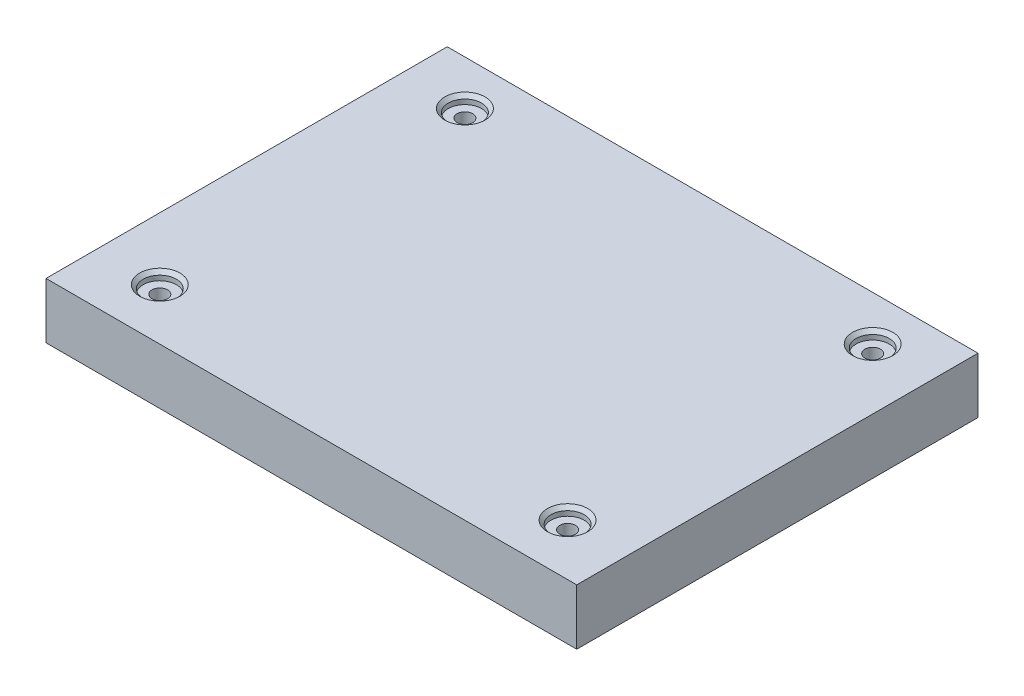
ISO-10303-21;
HEADER;
FILE_DESCRIPTION(('STEP AP214'),'2;1');
FILE_NAME('part.step','',(''),(''),'','','');
FILE_SCHEMA(('AUTOMOTIVE_DESIGN { 1 0 10303 214 1 1 1 1 }'));
ENDSEC;
DATA;
#1=APPLICATION_CONTEXT('core data for automotive mechanical design processes');
#2=APPLICATION_PROTOCOL_DEFINITION('international standard','automotive_design',2000,#1);
#3=PRODUCT_CONTEXT('',#1,'mechanical');
#4=PRODUCT('Part','Part','',(#3));
#5=PRODUCT_RELATED_PRODUCT_CATEGORY('part','',(#4));
#6=PRODUCT_DEFINITION_FORMATION('','',#4);
#7=PRODUCT_DEFINITION_CONTEXT('part definition',#1,'design');
#8=PRODUCT_DEFINITION('design','',#6,#7);
#9=PRODUCT_DEFINITION_SHAPE('','',#8);
#10=(LENGTH_UNIT() NAMED_UNIT(*) SI_UNIT(.MILLI.,.METRE.));
#11=(NAMED_UNIT(*) PLANE_ANGLE_UNIT() SI_UNIT($,.RADIAN.));
#12=(NAMED_UNIT(*) SI_UNIT($,.STERADIAN.) SOLID_ANGLE_UNIT());
#13=UNCERTAINTY_MEASURE_WITH_UNIT(LENGTH_MEASURE(1.E-05),#10,'distance_accuracy_value','');
#14=(GEOMETRIC_REPRESENTATION_CONTEXT(3) GLOBAL_UNCERTAINTY_ASSIGNED_CONTEXT((#13)) GLOBAL_UNIT_ASSIGNED_CONTEXT((#10,
#11,#12)) REPRESENTATION_CONTEXT('',''));
#15=CARTESIAN_POINT('',(0.,0.,0.));
#16=DIRECTION('',(0.,0.,1.));
#17=DIRECTION('',(1.,0.,0.));
#18=AXIS2_PLACEMENT_3D('',#15,#16,#17);
#19=CARTESIAN_POINT('',(0.,10.,0.));
#20=DIRECTION('',(0.,-1.,0.));
#21=DIRECTION('',(0.,0.,-1.));
#22=AXIS2_PLACEMENT_3D('',#19,#20,#21);
#23=PLANE('',#22);
#24=CARTESIAN_POINT('',(11.17,10.,-9.23722147848022));
#25=DIRECTION('',(0.,1.,0.));
#26=DIRECTION('',(0.,0.,1.));
#27=AXIS2_PLACEMENT_3D('',#24,#25,#26);
#28=CIRCLE('',#27,3.61188);
#29=CARTESIAN_POINT('',(11.17,10.,-5.62534147848022));
#30=VERTEX_POINT('',#29);
#31=EDGE_CURVE('E168',#30,#30,#28,.T.);
#32=ORIENTED_EDGE('',*,*,#31,.F.);
#33=EDGE_LOOP('',(#32));
#34=FACE_BOUND('',#33,.T.);
#35=CARTESIAN_POINT('',(11.17,10.,-63.9442401855916));
#36=DIRECTION('',(0.,1.,0.));
#37=DIRECTION('',(0.,0.,1.));
#38=AXIS2_PLACEMENT_3D('',#35,#36,#37);
#39=CIRCLE('',#38,3.61188);
#40=CARTESIAN_POINT('',(11.17,10.,-60.3323601855916));
#41=VERTEX_POINT('',#40);
#42=EDGE_CURVE('E138',#41,#41,#39,.T.);
#43=ORIENTED_EDGE('',*,*,#42,.F.);
#44=EDGE_LOOP('',(#43));
#45=FACE_BOUND('',#44,.T.);
#46=CARTESIAN_POINT('',(84.2999996075257,10.,-9.22964498225284));
#47=DIRECTION('',(0.,1.,0.));
#48=DIRECTION('',(0.,0.,1.));
#49=AXIS2_PLACEMENT_3D('',#46,#47,#48);
#50=CIRCLE('',#49,3.61188);
#51=CARTESIAN_POINT('',(84.2999996075257,10.,-5.61776498225284));
#52=VERTEX_POINT('',#51);
#53=EDGE_CURVE('E123',#52,#52,#50,.T.);
#54=ORIENTED_EDGE('',*,*,#53,.F.);
#55=EDGE_LOOP('',(#54));
#56=FACE_BOUND('',#55,.T.);
#57=DIRECTION('',(0.,0.,1.));
#58=VECTOR('',#57,1.);
#59=CARTESIAN_POINT('',(0.,10.,0.));
#60=LINE('',#59,#58);
#61=CARTESIAN_POINT('',(0.,10.,-71.94964485833));
#62=VERTEX_POINT('',#61);
#63=CARTESIAN_POINT('',(0.,10.,0.));
#64=VERTEX_POINT('',#63);
#65=EDGE_CURVE('E85',#62,#64,#60,.T.);
#66=ORIENTED_EDGE('',*,*,#65,.T.);
#67=DIRECTION('',(1.,0.,0.));
#68=VECTOR('',#67,1.);
#69=CARTESIAN_POINT('',(0.,10.,0.));
#70=LINE('',#69,#68);
#71=CARTESIAN_POINT('',(95.169284226503,10.,0.));
#72=VERTEX_POINT('',#71);
#73=EDGE_CURVE('E80',#64,#72,#70,.T.);
#74=ORIENTED_EDGE('',*,*,#73,.T.);
#75=DIRECTION('',(0.,0.,-1.));
#76=VECTOR('',#75,1.);
#77=CARTESIAN_POINT('',(95.169284226503,10.,0.));
#78=LINE('',#77,#76);
#79=CARTESIAN_POINT('',(95.169284226503,10.,-71.94964485833));
#80=VERTEX_POINT('',#79);
#81=EDGE_CURVE('E83',#72,#80,#78,.T.);
#82=ORIENTED_EDGE('',*,*,#81,.T.);
#83=DIRECTION('',(-1.,0.,0.));
#84=VECTOR('',#83,1.);
#85=CARTESIAN_POINT('',(0.,10.,-71.94964485833));
#86=LINE('',#85,#84);
#87=EDGE_CURVE('E50',#80,#62,#86,.T.);
#88=ORIENTED_EDGE('',*,*,#87,.T.);
#89=EDGE_LOOP('',(#66,#74,#82,#88));
#90=FACE_BOUND('',#89,.T.);
#91=CARTESIAN_POINT('',(84.2963172661727,10.,-63.93964485833));
#92=DIRECTION('',(0.,1.,0.));
#93=DIRECTION('',(0.,0.,1.));
#94=AXIS2_PLACEMENT_3D('',#91,#92,#93);
#95=CIRCLE('',#94,3.61188);
#96=CARTESIAN_POINT('',(84.2963172661727,10.,-60.32776485833));
#97=VERTEX_POINT('',#96);
#98=EDGE_CURVE('E153',#97,#97,#95,.T.);
#99=ORIENTED_EDGE('',*,*,#98,.F.);
#100=EDGE_LOOP('',(#99));
#101=FACE_BOUND('',#100,.T.);
#102=ADVANCED_FACE('F33',(#34,#45,#56,#90,#101),#23,.F.);
#103=CARTESIAN_POINT('',(0.,0.,0.));
#104=DIRECTION('',(0.,-1.,0.));
#105=DIRECTION('',(0.,0.,-1.));
#106=AXIS2_PLACEMENT_3D('',#103,#104,#105);
#107=PLANE('',#106);
#108=CARTESIAN_POINT('',(11.17,0.,-9.23722147848022));
#109=DIRECTION('',(0.,1.,0.));
#110=DIRECTION('',(0.,0.,1.));
#111=AXIS2_PLACEMENT_3D('',#108,#109,#110);
#112=CIRCLE('',#111,1.397);
#113=CARTESIAN_POINT('',(11.17,0.,-7.84022147848023));
#114=VERTEX_POINT('',#113);
#115=EDGE_CURVE('E156',#114,#114,#112,.T.);
#116=ORIENTED_EDGE('',*,*,#115,.T.);
#117=EDGE_LOOP('',(#116));
#118=FACE_BOUND('',#117,.T.);
#119=CARTESIAN_POINT('',(84.2963172661727,0.,-63.93964485833));
#120=DIRECTION('',(0.,1.,0.));
#121=DIRECTION('',(0.,0.,1.));
#122=AXIS2_PLACEMENT_3D('',#119,#120,#121);
#123=CIRCLE('',#122,1.397);
#124=CARTESIAN_POINT('',(84.2963172661727,0.,-62.54264485833));
#125=VERTEX_POINT('',#124);
#126=EDGE_CURVE('E141',#125,#125,#123,.T.);
#127=ORIENTED_EDGE('',*,*,#126,.T.);
#128=EDGE_LOOP('',(#127));
#129=FACE_BOUND('',#128,.T.);
#130=DIRECTION('',(0.,0.,1.));
#131=VECTOR('',#130,1.);
#132=CARTESIAN_POINT('',(0.,0.,0.));
#133=LINE('',#132,#131);
#134=CARTESIAN_POINT('',(0.,0.,-71.94964485833));
#135=VERTEX_POINT('',#134);
#136=CARTESIAN_POINT('',(0.,0.,0.));
#137=VERTEX_POINT('',#136);
#138=EDGE_CURVE('E97',#135,#137,#133,.T.);
#139=ORIENTED_EDGE('',*,*,#138,.F.);
#140=DIRECTION('',(-1.,0.,0.));
#141=VECTOR('',#140,1.);
#142=CARTESIAN_POINT('',(0.,0.,-71.94964485833));
#143=LINE('',#142,#141);
#144=CARTESIAN_POINT('',(95.169284226503,0.,-71.94964485833));
#145=VERTEX_POINT('',#144);
#146=EDGE_CURVE('E73',#145,#135,#143,.T.);
#147=ORIENTED_EDGE('',*,*,#146,.F.);
#148=DIRECTION('',(0.,0.,-1.));
#149=VECTOR('',#148,1.);
#150=CARTESIAN_POINT('',(95.169284226503,0.,0.));
#151=LINE('',#150,#149);
#152=CARTESIAN_POINT('',(95.169284226503,0.,0.));
#153=VERTEX_POINT('',#152);
#154=EDGE_CURVE('E67',#153,#145,#151,.T.);
#155=ORIENTED_EDGE('',*,*,#154,.F.);
#156=DIRECTION('',(1.,0.,0.));
#157=VECTOR('',#156,1.);
#158=CARTESIAN_POINT('',(0.,0.,0.));
#159=LINE('',#158,#157);
#160=EDGE_CURVE('E89',#137,#153,#159,.T.);
#161=ORIENTED_EDGE('',*,*,#160,.F.);
#162=EDGE_LOOP('',(#139,#147,#155,#161));
#163=FACE_BOUND('',#162,.T.);
#164=CARTESIAN_POINT('',(84.2999996075257,0.,-9.22964498225284));
#165=DIRECTION('',(0.,1.,0.));
#166=DIRECTION('',(0.,0.,1.));
#167=AXIS2_PLACEMENT_3D('',#164,#165,#166);
#168=CIRCLE('',#167,1.397);
#169=CARTESIAN_POINT('',(84.2999996075257,0.,-7.83264498225284));
#170=VERTEX_POINT('',#169);
#171=EDGE_CURVE('E100',#170,#170,#168,.T.);
#172=ORIENTED_EDGE('',*,*,#171,.T.);
#173=EDGE_LOOP('',(#172));
#174=FACE_BOUND('',#173,.T.);
#175=CARTESIAN_POINT('',(11.17,0.,-63.9442401855916));
#176=DIRECTION('',(0.,1.,0.));
#177=DIRECTION('',(0.,0.,1.));
#178=AXIS2_PLACEMENT_3D('',#175,#176,#177);
#179=CIRCLE('',#178,1.397);
#180=CARTESIAN_POINT('',(11.17,0.,-62.5472401855916));
#181=VERTEX_POINT('',#180);
#182=EDGE_CURVE('E126',#181,#181,#179,.T.);
#183=ORIENTED_EDGE('',*,*,#182,.T.);
#184=EDGE_LOOP('',(#183));
#185=FACE_BOUND('',#184,.T.);
#186=ADVANCED_FACE('F108',(#118,#129,#163,#174,#185),#107,.T.);
#187=CARTESIAN_POINT('',(0.,10.,0.));
#188=DIRECTION('',(1.,0.,0.));
#189=DIRECTION('',(0.,0.,-1.));
#190=AXIS2_PLACEMENT_3D('',#187,#188,#189);
#191=PLANE('',#190);
#192=ORIENTED_EDGE('',*,*,#138,.T.);
#193=DIRECTION('',(0.,-1.,0.));
#194=VECTOR('',#193,1.);
#195=CARTESIAN_POINT('',(0.,10.,0.));
#196=LINE('',#195,#194);
#197=EDGE_CURVE('E11',#64,#137,#196,.T.);
#198=ORIENTED_EDGE('',*,*,#197,.F.);
#199=ORIENTED_EDGE('',*,*,#65,.F.);
#200=DIRECTION('',(0.,-1.,0.));
#201=VECTOR('',#200,1.);
#202=CARTESIAN_POINT('',(0.,10.,-71.94964485833));
#203=LINE('',#202,#201);
#204=EDGE_CURVE('E93',#62,#135,#203,.T.);
#205=ORIENTED_EDGE('',*,*,#204,.T.);
#206=EDGE_LOOP('',(#192,#198,#199,#205));
#207=FACE_BOUND('',#206,.T.);
#208=ADVANCED_FACE('F35',(#207),#191,.F.);
#209=CARTESIAN_POINT('',(0.,10.,0.));
#210=DIRECTION('',(0.,0.,-1.));
#211=DIRECTION('',(-1.,0.,0.));
#212=AXIS2_PLACEMENT_3D('',#209,#210,#211);
#213=PLANE('',#212);
#214=ORIENTED_EDGE('',*,*,#160,.T.);
#215=DIRECTION('',(0.,-1.,0.));
#216=VECTOR('',#215,1.);
#217=CARTESIAN_POINT('',(95.169284226503,10.,0.));
#218=LINE('',#217,#216);
#219=EDGE_CURVE('E42',#72,#153,#218,.T.);
#220=ORIENTED_EDGE('',*,*,#219,.F.);
#221=ORIENTED_EDGE('',*,*,#73,.F.);
#222=ORIENTED_EDGE('',*,*,#197,.T.);
#223=EDGE_LOOP('',(#214,#220,#221,#222));
#224=FACE_BOUND('',#223,.T.);
#225=ADVANCED_FACE('F88',(#224),#213,.F.);
#226=CARTESIAN_POINT('',(95.169284226503,10.,0.));
#227=DIRECTION('',(-1.,0.,0.));
#228=DIRECTION('',(0.,0.,1.));
#229=AXIS2_PLACEMENT_3D('',#226,#227,#228);
#230=PLANE('',#229);
#231=ORIENTED_EDGE('',*,*,#154,.T.);
#232=DIRECTION('',(0.,-1.,0.));
#233=VECTOR('',#232,1.);
#234=CARTESIAN_POINT('',(95.169284226503,10.,-71.94964485833));
#235=LINE('',#234,#233);
#236=EDGE_CURVE('E90',#80,#145,#235,.T.);
#237=ORIENTED_EDGE('',*,*,#236,.F.);
#238=ORIENTED_EDGE('',*,*,#81,.F.);
#239=ORIENTED_EDGE('',*,*,#219,.T.);
#240=EDGE_LOOP('',(#231,#237,#238,#239));
#241=FACE_BOUND('',#240,.T.);
#242=ADVANCED_FACE('F91',(#241),#230,.F.);
#243=CARTESIAN_POINT('',(0.,10.,-71.94964485833));
#244=DIRECTION('',(0.,0.,1.));
#245=DIRECTION('',(1.,0.,0.));
#246=AXIS2_PLACEMENT_3D('',#243,#244,#245);
#247=PLANE('',#246);
#248=ORIENTED_EDGE('',*,*,#146,.T.);
#249=ORIENTED_EDGE('',*,*,#204,.F.);
#250=ORIENTED_EDGE('',*,*,#87,.F.);
#251=ORIENTED_EDGE('',*,*,#236,.T.);
#252=EDGE_LOOP('',(#248,#249,#250,#251));
#253=FACE_BOUND('',#252,.T.);
#254=ADVANCED_FACE('F105',(#253),#247,.F.);
#255=CARTESIAN_POINT('',(84.2999996075257,10.,-9.22964498225284));
#256=DIRECTION('',(0.,1.,0.));
#257=DIRECTION('',(0.,0.,1.));
#258=AXIS2_PLACEMENT_3D('',#255,#256,#257);
#259=CYLINDRICAL_SURFACE('',#258,1.397);
#260=ORIENTED_EDGE('',*,*,#171,.F.);
#261=EDGE_LOOP('',(#260));
#262=FACE_BOUND('',#261,.T.);
#263=CARTESIAN_POINT('',(84.2999996075257,8.5014,-9.22964498225284));
#264=DIRECTION('',(0.,1.,0.));
#265=DIRECTION('',(0.,0.,1.));
#266=AXIS2_PLACEMENT_3D('',#263,#264,#265);
#267=CIRCLE('',#266,1.397);
#268=CARTESIAN_POINT('',(84.2999996075257,8.5014,-7.83264498225284));
#269=VERTEX_POINT('',#268);
#270=EDGE_CURVE('E114',#269,#269,#267,.T.);
#271=ORIENTED_EDGE('',*,*,#270,.T.);
#272=EDGE_LOOP('',(#271));
#273=FACE_BOUND('',#272,.T.);
#274=ADVANCED_FACE('F202',(#262,#273),#259,.F.);
#275=CARTESIAN_POINT('',(87.2768796075257,8.5014,-9.22964498225284));
#276=DIRECTION('',(0.,-1.,0.));
#277=DIRECTION('',(0.,0.,-1.));
#278=AXIS2_PLACEMENT_3D('',#275,#276,#277);
#279=PLANE('',#278);
#280=ORIENTED_EDGE('',*,*,#270,.F.);
#281=EDGE_LOOP('',(#280));
#282=FACE_BOUND('',#281,.T.);
#283=CARTESIAN_POINT('',(84.2999996075257,8.5014,-9.22964498225284));
#284=DIRECTION('',(0.,1.,0.));
#285=DIRECTION('',(0.,0.,1.));
#286=AXIS2_PLACEMENT_3D('',#283,#284,#285);
#287=CIRCLE('',#286,2.97688);
#288=CARTESIAN_POINT('',(84.2999996075257,8.5014,-6.25276498225284));
#289=VERTEX_POINT('',#288);
#290=EDGE_CURVE('E117',#289,#289,#287,.T.);
#291=ORIENTED_EDGE('',*,*,#290,.T.);
#292=EDGE_LOOP('',(#291));
#293=FACE_BOUND('',#292,.T.);
#294=ADVANCED_FACE('F194',(#282,#293),#279,.F.);
#295=CARTESIAN_POINT('',(84.2999996075257,10.,-9.22964498225284));
#296=DIRECTION('',(0.,1.,0.));
#297=DIRECTION('',(0.,0.,1.));
#298=AXIS2_PLACEMENT_3D('',#295,#296,#297);
#299=CYLINDRICAL_SURFACE('',#298,2.97688);
#300=ORIENTED_EDGE('',*,*,#290,.F.);
#301=EDGE_LOOP('',(#300));
#302=FACE_BOUND('',#301,.T.);
#303=CARTESIAN_POINT('',(84.2999996075257,9.365,-9.22964498225284));
#304=DIRECTION('',(0.,1.,0.));
#305=DIRECTION('',(0.,0.,1.));
#306=AXIS2_PLACEMENT_3D('',#303,#304,#305);
#307=CIRCLE('',#306,2.97688);
#308=CARTESIAN_POINT('',(84.2999996075257,9.365,-6.25276498225284));
#309=VERTEX_POINT('',#308);
#310=EDGE_CURVE('E120',#309,#309,#307,.T.);
#311=ORIENTED_EDGE('',*,*,#310,.T.);
#312=EDGE_LOOP('',(#311));
#313=FACE_BOUND('',#312,.T.);
#314=ADVANCED_FACE('F184',(#302,#313),#299,.F.);
#315=CARTESIAN_POINT('',(84.2999996075257,10.,-9.22964498225284));
#316=DIRECTION('',(0.,1.,0.));
#317=DIRECTION('',(0.,0.,1.));
#318=AXIS2_PLACEMENT_3D('',#315,#316,#317);
#319=CONICAL_SURFACE('',#318,3.61188,0.785398163397446);
#320=ORIENTED_EDGE('',*,*,#310,.F.);
#321=EDGE_LOOP('',(#320));
#322=FACE_BOUND('',#321,.T.);
#323=ORIENTED_EDGE('',*,*,#53,.T.);
#324=EDGE_LOOP('',(#323));
#325=FACE_BOUND('',#324,.T.);
#326=ADVANCED_FACE('F181',(#322,#325),#319,.F.);
#327=CARTESIAN_POINT('',(11.17,10.,-63.9442401855916));
#328=DIRECTION('',(0.,1.,0.));
#329=DIRECTION('',(0.,0.,1.));
#330=AXIS2_PLACEMENT_3D('',#327,#328,#329);
#331=CYLINDRICAL_SURFACE('',#330,1.397);
#332=ORIENTED_EDGE('',*,*,#182,.F.);
#333=EDGE_LOOP('',(#332));
#334=FACE_BOUND('',#333,.T.);
#335=CARTESIAN_POINT('',(11.17,8.5014,-63.9442401855916));
#336=DIRECTION('',(0.,1.,0.));
#337=DIRECTION('',(0.,0.,1.));
#338=AXIS2_PLACEMENT_3D('',#335,#336,#337);
#339=CIRCLE('',#338,1.397);
#340=CARTESIAN_POINT('',(11.17,8.5014,-62.5472401855916));
#341=VERTEX_POINT('',#340);
#342=EDGE_CURVE('E129',#341,#341,#339,.T.);
#343=ORIENTED_EDGE('',*,*,#342,.T.);
#344=EDGE_LOOP('',(#343));
#345=FACE_BOUND('',#344,.T.);
#346=ADVANCED_FACE('F183',(#334,#345),#331,.F.);
#347=CARTESIAN_POINT('',(14.14688,8.5014,-63.9442401855916));
#348=DIRECTION('',(0.,-1.,0.));
#349=DIRECTION('',(0.,0.,-1.));
#350=AXIS2_PLACEMENT_3D('',#347,#348,#349);
#351=PLANE('',#350);
#352=ORIENTED_EDGE('',*,*,#342,.F.);
#353=EDGE_LOOP('',(#352));
#354=FACE_BOUND('',#353,.T.);
#355=CARTESIAN_POINT('',(11.17,8.5014,-63.9442401855916));
#356=DIRECTION('',(0.,1.,0.));
#357=DIRECTION('',(0.,0.,1.));
#358=AXIS2_PLACEMENT_3D('',#355,#356,#357);
#359=CIRCLE('',#358,2.97688);
#360=CARTESIAN_POINT('',(11.17,8.5014,-60.9673601855916));
#361=VERTEX_POINT('',#360);
#362=EDGE_CURVE('E132',#361,#361,#359,.T.);
#363=ORIENTED_EDGE('',*,*,#362,.T.);
#364=EDGE_LOOP('',(#363));
#365=FACE_BOUND('',#364,.T.);
#366=ADVANCED_FACE('F191',(#354,#365),#351,.F.);
#367=CARTESIAN_POINT('',(11.17,10.,-63.9442401855916));
#368=DIRECTION('',(0.,1.,0.));
#369=DIRECTION('',(0.,0.,1.));
#370=AXIS2_PLACEMENT_3D('',#367,#368,#369);
#371=CYLINDRICAL_SURFACE('',#370,2.97688);
#372=ORIENTED_EDGE('',*,*,#362,.F.);
#373=EDGE_LOOP('',(#372));
#374=FACE_BOUND('',#373,.T.);
#375=CARTESIAN_POINT('',(11.17,9.365,-63.9442401855916));
#376=DIRECTION('',(0.,1.,0.));
#377=DIRECTION('',(0.,0.,1.));
#378=AXIS2_PLACEMENT_3D('',#375,#376,#377);
#379=CIRCLE('',#378,2.97688);
#380=CARTESIAN_POINT('',(11.17,9.365,-60.9673601855916));
#381=VERTEX_POINT('',#380);
#382=EDGE_CURVE('E135',#381,#381,#379,.T.);
#383=ORIENTED_EDGE('',*,*,#382,.T.);
#384=EDGE_LOOP('',(#383));
#385=FACE_BOUND('',#384,.T.);
#386=ADVANCED_FACE('F278',(#374,#385),#371,.F.);
#387=CARTESIAN_POINT('',(11.17,10.,-63.9442401855916));
#388=DIRECTION('',(0.,1.,0.));
#389=DIRECTION('',(0.,0.,1.));
#390=AXIS2_PLACEMENT_3D('',#387,#388,#389);
#391=CONICAL_SURFACE('',#390,3.61188,0.785398163397448);
#392=ORIENTED_EDGE('',*,*,#382,.F.);
#393=EDGE_LOOP('',(#392));
#394=FACE_BOUND('',#393,.T.);
#395=ORIENTED_EDGE('',*,*,#42,.T.);
#396=EDGE_LOOP('',(#395));
#397=FACE_BOUND('',#396,.T.);
#398=ADVANCED_FACE('F287',(#394,#397),#391,.F.);
#399=CARTESIAN_POINT('',(84.2963172661727,10.,-63.93964485833));
#400=DIRECTION('',(0.,1.,0.));
#401=DIRECTION('',(0.,0.,1.));
#402=AXIS2_PLACEMENT_3D('',#399,#400,#401);
#403=CYLINDRICAL_SURFACE('',#402,1.397);
#404=ORIENTED_EDGE('',*,*,#126,.F.);
#405=EDGE_LOOP('',(#404));
#406=FACE_BOUND('',#405,.T.);
#407=CARTESIAN_POINT('',(84.2963172661727,8.5014,-63.93964485833));
#408=DIRECTION('',(0.,1.,0.));
#409=DIRECTION('',(0.,0.,1.));
#410=AXIS2_PLACEMENT_3D('',#407,#408,#409);
#411=CIRCLE('',#410,1.397);
#412=CARTESIAN_POINT('',(84.2963172661727,8.5014,-62.54264485833));
#413=VERTEX_POINT('',#412);
#414=EDGE_CURVE('E144',#413,#413,#411,.T.);
#415=ORIENTED_EDGE('',*,*,#414,.T.);
#416=EDGE_LOOP('',(#415));
#417=FACE_BOUND('',#416,.T.);
#418=ADVANCED_FACE('F297',(#406,#417),#403,.F.);
#419=CARTESIAN_POINT('',(87.2731972661727,8.5014,-63.93964485833));
#420=DIRECTION('',(0.,-1.,0.));
#421=DIRECTION('',(0.,0.,-1.));
#422=AXIS2_PLACEMENT_3D('',#419,#420,#421);
#423=PLANE('',#422);
#424=ORIENTED_EDGE('',*,*,#414,.F.);
#425=EDGE_LOOP('',(#424));
#426=FACE_BOUND('',#425,.T.);
#427=CARTESIAN_POINT('',(84.2963172661727,8.5014,-63.93964485833));
#428=DIRECTION('',(0.,1.,0.));
#429=DIRECTION('',(0.,0.,1.));
#430=AXIS2_PLACEMENT_3D('',#427,#428,#429);
#431=CIRCLE('',#430,2.97688);
#432=CARTESIAN_POINT('',(84.2963172661727,8.5014,-60.96276485833));
#433=VERTEX_POINT('',#432);
#434=EDGE_CURVE('E147',#433,#433,#431,.T.);
#435=ORIENTED_EDGE('',*,*,#434,.T.);
#436=EDGE_LOOP('',(#435));
#437=FACE_BOUND('',#436,.T.);
#438=ADVANCED_FACE('F307',(#426,#437),#423,.F.);
#439=CARTESIAN_POINT('',(84.2963172661727,10.,-63.93964485833));
#440=DIRECTION('',(0.,1.,0.));
#441=DIRECTION('',(0.,0.,1.));
#442=AXIS2_PLACEMENT_3D('',#439,#440,#441);
#443=CYLINDRICAL_SURFACE('',#442,2.97688);
#444=ORIENTED_EDGE('',*,*,#434,.F.);
#445=EDGE_LOOP('',(#444));
#446=FACE_BOUND('',#445,.T.);
#447=CARTESIAN_POINT('',(84.2963172661727,9.365,-63.93964485833));
#448=DIRECTION('',(0.,1.,0.));
#449=DIRECTION('',(0.,0.,1.));
#450=AXIS2_PLACEMENT_3D('',#447,#448,#449);
#451=CIRCLE('',#450,2.97688);
#452=CARTESIAN_POINT('',(84.2963172661727,9.365,-60.96276485833));
#453=VERTEX_POINT('',#452);
#454=EDGE_CURVE('E150',#453,#453,#451,.T.);
#455=ORIENTED_EDGE('',*,*,#454,.T.);
#456=EDGE_LOOP('',(#455));
#457=FACE_BOUND('',#456,.T.);
#458=ADVANCED_FACE('F317',(#446,#457),#443,.F.);
#459=CARTESIAN_POINT('',(84.2963172661727,10.,-63.93964485833));
#460=DIRECTION('',(0.,1.,0.));
#461=DIRECTION('',(0.,0.,1.));
#462=AXIS2_PLACEMENT_3D('',#459,#460,#461);
#463=CONICAL_SURFACE('',#462,3.61188,0.785398163397446);
#464=ORIENTED_EDGE('',*,*,#454,.F.);
#465=EDGE_LOOP('',(#464));
#466=FACE_BOUND('',#465,.T.);
#467=ORIENTED_EDGE('',*,*,#98,.T.);
#468=EDGE_LOOP('',(#467));
#469=FACE_BOUND('',#468,.T.);
#470=ADVANCED_FACE('F327',(#466,#469),#463,.F.);
#471=CARTESIAN_POINT('',(11.17,10.,-9.23722147848022));
#472=DIRECTION('',(0.,1.,0.));
#473=DIRECTION('',(0.,0.,1.));
#474=AXIS2_PLACEMENT_3D('',#471,#472,#473);
#475=CYLINDRICAL_SURFACE('',#474,1.397);
#476=ORIENTED_EDGE('',*,*,#115,.F.);
#477=EDGE_LOOP('',(#476));
#478=FACE_BOUND('',#477,.T.);
#479=CARTESIAN_POINT('',(11.17,8.5014,-9.23722147848022));
#480=DIRECTION('',(0.,1.,0.));
#481=DIRECTION('',(0.,0.,1.));
#482=AXIS2_PLACEMENT_3D('',#479,#480,#481);
#483=CIRCLE('',#482,1.397);
#484=CARTESIAN_POINT('',(11.17,8.5014,-7.84022147848023));
#485=VERTEX_POINT('',#484);
#486=EDGE_CURVE('E159',#485,#485,#483,.T.);
#487=ORIENTED_EDGE('',*,*,#486,.T.);
#488=EDGE_LOOP('',(#487));
#489=FACE_BOUND('',#488,.T.);
#490=ADVANCED_FACE('F337',(#478,#489),#475,.F.);
#491=CARTESIAN_POINT('',(14.14688,8.5014,-9.23722147848022));
#492=DIRECTION('',(0.,-1.,0.));
#493=DIRECTION('',(0.,0.,-1.));
#494=AXIS2_PLACEMENT_3D('',#491,#492,#493);
#495=PLANE('',#494);
#496=ORIENTED_EDGE('',*,*,#486,.F.);
#497=EDGE_LOOP('',(#496));
#498=FACE_BOUND('',#497,.T.);
#499=CARTESIAN_POINT('',(11.17,8.5014,-9.23722147848022));
#500=DIRECTION('',(0.,1.,0.));
#501=DIRECTION('',(0.,0.,1.));
#502=AXIS2_PLACEMENT_3D('',#499,#500,#501);
#503=CIRCLE('',#502,2.97688);
#504=CARTESIAN_POINT('',(11.17,8.5014,-6.26034147848022));
#505=VERTEX_POINT('',#504);
#506=EDGE_CURVE('E162',#505,#505,#503,.T.);
#507=ORIENTED_EDGE('',*,*,#506,.T.);
#508=EDGE_LOOP('',(#507));
#509=FACE_BOUND('',#508,.T.);
#510=ADVANCED_FACE('F347',(#498,#509),#495,.F.);
#511=CARTESIAN_POINT('',(11.17,10.,-9.23722147848022));
#512=DIRECTION('',(0.,1.,0.));
#513=DIRECTION('',(0.,0.,1.));
#514=AXIS2_PLACEMENT_3D('',#511,#512,#513);
#515=CYLINDRICAL_SURFACE('',#514,2.97688);
#516=ORIENTED_EDGE('',*,*,#506,.F.);
#517=EDGE_LOOP('',(#516));
#518=FACE_BOUND('',#517,.T.);
#519=CARTESIAN_POINT('',(11.17,9.365,-9.23722147848022));
#520=DIRECTION('',(0.,1.,0.));
#521=DIRECTION('',(0.,0.,1.));
#522=AXIS2_PLACEMENT_3D('',#519,#520,#521);
#523=CIRCLE('',#522,2.97688);
#524=CARTESIAN_POINT('',(11.17,9.365,-6.26034147848022));
#525=VERTEX_POINT('',#524);
#526=EDGE_CURVE('E165',#525,#525,#523,.T.);
#527=ORIENTED_EDGE('',*,*,#526,.T.);
#528=EDGE_LOOP('',(#527));
#529=FACE_BOUND('',#528,.T.);
#530=ADVANCED_FACE('F357',(#518,#529),#515,.F.);
#531=CARTESIAN_POINT('',(11.17,10.,-9.23722147848022));
#532=DIRECTION('',(0.,1.,0.));
#533=DIRECTION('',(0.,0.,1.));
#534=AXIS2_PLACEMENT_3D('',#531,#532,#533);
#535=CONICAL_SURFACE('',#534,3.61188,0.785398163397448);
#536=ORIENTED_EDGE('',*,*,#526,.F.);
#537=EDGE_LOOP('',(#536));
#538=FACE_BOUND('',#537,.T.);
#539=ORIENTED_EDGE('',*,*,#31,.T.);
#540=EDGE_LOOP('',(#539));
#541=FACE_BOUND('',#540,.T.);
#542=ADVANCED_FACE('F172',(#538,#541),#535,.F.);
#543=CLOSED_SHELL('',(#102,#186,#208,#225,#242,#254,#274,#294,#314,#326,#346,#366,#386,#398,
#418,#438,#458,#470,#490,#510,#530,#542));
#544=MANIFOLD_SOLID_BREP('B2',#543);
#545=ADVANCED_BREP_SHAPE_REPRESENTATION('',(#18,#544),#14);
#546=SHAPE_DEFINITION_REPRESENTATION(#9,#545);
ENDSEC;
END-ISO-10303-21;
